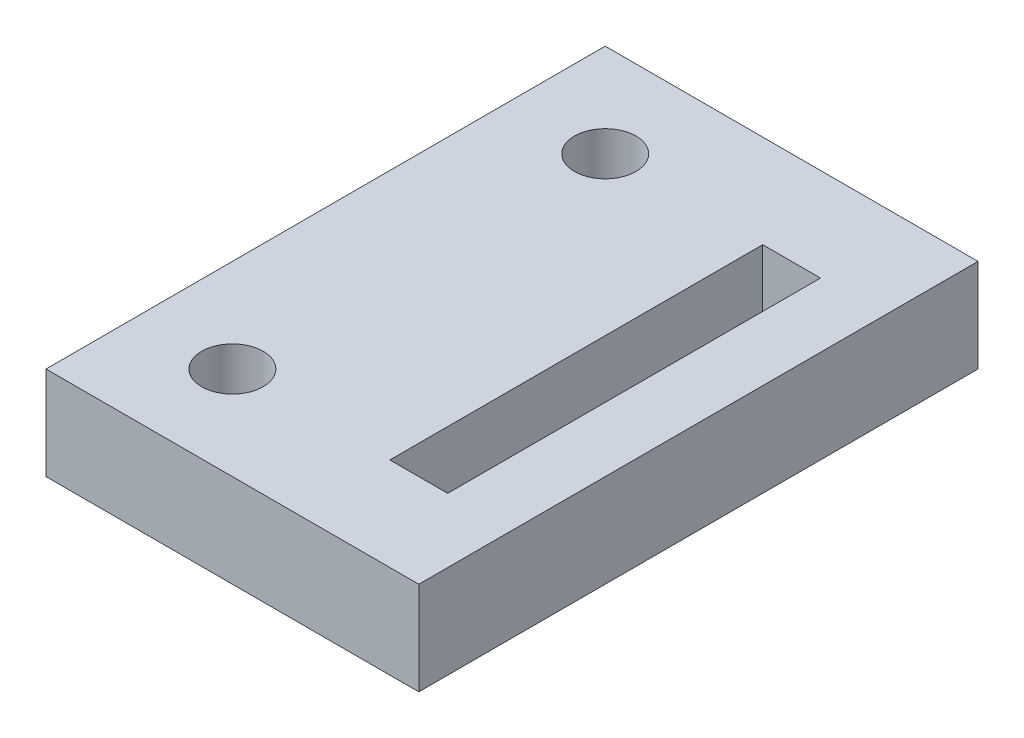
ISO-10303-21;
HEADER;
FILE_DESCRIPTION(('STEP AP214'),'2;1');
FILE_NAME('part.step','',(''),(''),'','','');
FILE_SCHEMA(('AUTOMOTIVE_DESIGN { 1 0 10303 214 1 1 1 1 }'));
ENDSEC;
DATA;
#1=APPLICATION_CONTEXT('core data for automotive mechanical design processes');
#2=APPLICATION_PROTOCOL_DEFINITION('international standard','automotive_design',2000,#1);
#3=PRODUCT_CONTEXT('',#1,'mechanical');
#4=PRODUCT('Part','Part','',(#3));
#5=PRODUCT_RELATED_PRODUCT_CATEGORY('part','',(#4));
#6=PRODUCT_DEFINITION_FORMATION('','',#4);
#7=PRODUCT_DEFINITION_CONTEXT('part definition',#1,'design');
#8=PRODUCT_DEFINITION('design','',#6,#7);
#9=PRODUCT_DEFINITION_SHAPE('','',#8);
#10=(LENGTH_UNIT() NAMED_UNIT(*) SI_UNIT(.MILLI.,.METRE.));
#11=(NAMED_UNIT(*) PLANE_ANGLE_UNIT() SI_UNIT($,.RADIAN.));
#12=(NAMED_UNIT(*) SI_UNIT($,.STERADIAN.) SOLID_ANGLE_UNIT());
#13=UNCERTAINTY_MEASURE_WITH_UNIT(LENGTH_MEASURE(1.E-05),#10,'distance_accuracy_value','');
#14=(GEOMETRIC_REPRESENTATION_CONTEXT(3) GLOBAL_UNCERTAINTY_ASSIGNED_CONTEXT((#13)) GLOBAL_UNIT_ASSIGNED_CONTEXT((#10,
#11,#12)) REPRESENTATION_CONTEXT('',''));
#15=CARTESIAN_POINT('',(0.,0.,0.));
#16=DIRECTION('',(0.,0.,1.));
#17=DIRECTION('',(1.,0.,0.));
#18=AXIS2_PLACEMENT_3D('',#15,#16,#17);
#19=CARTESIAN_POINT('',(0.,5.,0.));
#20=DIRECTION('',(-1.,0.,0.));
#21=DIRECTION('',(0.,0.,1.));
#22=AXIS2_PLACEMENT_3D('',#19,#20,#21);
#23=PLANE('',#22);
#24=DIRECTION('',(0.,0.,-1.));
#25=VECTOR('',#24,1.);
#26=CARTESIAN_POINT('',(0.,0.,0.));
#27=LINE('',#26,#25);
#28=CARTESIAN_POINT('',(0.,0.,0.));
#29=VERTEX_POINT('',#28);
#30=CARTESIAN_POINT('',(0.,0.,-30.));
#31=VERTEX_POINT('',#30);
#32=EDGE_CURVE('E152',#29,#31,#27,.T.);
#33=ORIENTED_EDGE('',*,*,#32,.F.);
#34=DIRECTION('',(0.,-1.,0.));
#35=VECTOR('',#34,1.);
#36=CARTESIAN_POINT('',(0.,5.,0.));
#37=LINE('',#36,#35);
#38=CARTESIAN_POINT('',(0.,5.,0.));
#39=VERTEX_POINT('',#38);
#40=EDGE_CURVE('E11',#39,#29,#37,.T.);
#41=ORIENTED_EDGE('',*,*,#40,.F.);
#42=DIRECTION('',(0.,0.,-1.));
#43=VECTOR('',#42,1.);
#44=CARTESIAN_POINT('',(0.,5.,0.));
#45=LINE('',#44,#43);
#46=CARTESIAN_POINT('',(0.,5.,-30.));
#47=VERTEX_POINT('',#46);
#48=EDGE_CURVE('E118',#39,#47,#45,.T.);
#49=ORIENTED_EDGE('',*,*,#48,.T.);
#50=DIRECTION('',(0.,-1.,0.));
#51=VECTOR('',#50,1.);
#52=CARTESIAN_POINT('',(0.,5.,-30.));
#53=LINE('',#52,#51);
#54=EDGE_CURVE('E57',#47,#31,#53,.T.);
#55=ORIENTED_EDGE('',*,*,#54,.T.);
#56=EDGE_LOOP('',(#33,#41,#49,#55));
#57=FACE_BOUND('',#56,.T.);
#58=ADVANCED_FACE('F38',(#57),#23,.T.);
#59=CARTESIAN_POINT('',(0.,5.,0.));
#60=DIRECTION('',(0.,0.,-1.));
#61=DIRECTION('',(-1.,0.,0.));
#62=AXIS2_PLACEMENT_3D('',#59,#60,#61);
#63=PLANE('',#62);
#64=DIRECTION('',(1.,0.,0.));
#65=VECTOR('',#64,1.);
#66=CARTESIAN_POINT('',(0.,0.,0.));
#67=LINE('',#66,#65);
#68=CARTESIAN_POINT('',(20.,0.,0.));
#69=VERTEX_POINT('',#68);
#70=EDGE_CURVE('E124',#29,#69,#67,.T.);
#71=ORIENTED_EDGE('',*,*,#70,.T.);
#72=DIRECTION('',(0.,-1.,0.));
#73=VECTOR('',#72,1.);
#74=CARTESIAN_POINT('',(20.,5.,0.));
#75=LINE('',#74,#73);
#76=CARTESIAN_POINT('',(20.,5.,0.));
#77=VERTEX_POINT('',#76);
#78=EDGE_CURVE('E48',#77,#69,#75,.T.);
#79=ORIENTED_EDGE('',*,*,#78,.F.);
#80=DIRECTION('',(1.,0.,0.));
#81=VECTOR('',#80,1.);
#82=CARTESIAN_POINT('',(0.,5.,0.));
#83=LINE('',#82,#81);
#84=EDGE_CURVE('E111',#39,#77,#83,.T.);
#85=ORIENTED_EDGE('',*,*,#84,.F.);
#86=ORIENTED_EDGE('',*,*,#40,.T.);
#87=EDGE_LOOP('',(#71,#79,#85,#86));
#88=FACE_BOUND('',#87,.T.);
#89=ADVANCED_FACE('F122',(#88),#63,.F.);
#90=CARTESIAN_POINT('',(20.,5.,0.));
#91=DIRECTION('',(1.,0.,0.));
#92=DIRECTION('',(0.,0.,-1.));
#93=AXIS2_PLACEMENT_3D('',#90,#91,#92);
#94=PLANE('',#93);
#95=DIRECTION('',(0.,0.,1.));
#96=VECTOR('',#95,1.);
#97=CARTESIAN_POINT('',(20.,0.,0.));
#98=LINE('',#97,#96);
#99=CARTESIAN_POINT('',(20.,0.,-30.));
#100=VERTEX_POINT('',#99);
#101=EDGE_CURVE('E155',#100,#69,#98,.T.);
#102=ORIENTED_EDGE('',*,*,#101,.F.);
#103=DIRECTION('',(0.,-1.,0.));
#104=VECTOR('',#103,1.);
#105=CARTESIAN_POINT('',(20.,5.,-30.));
#106=LINE('',#105,#104);
#107=CARTESIAN_POINT('',(20.,5.,-30.));
#108=VERTEX_POINT('',#107);
#109=EDGE_CURVE('E82',#108,#100,#106,.T.);
#110=ORIENTED_EDGE('',*,*,#109,.F.);
#111=DIRECTION('',(0.,0.,1.));
#112=VECTOR('',#111,1.);
#113=CARTESIAN_POINT('',(20.,5.,0.));
#114=LINE('',#113,#112);
#115=EDGE_CURVE('E117',#108,#77,#114,.T.);
#116=ORIENTED_EDGE('',*,*,#115,.T.);
#117=ORIENTED_EDGE('',*,*,#78,.T.);
#118=EDGE_LOOP('',(#102,#110,#116,#117));
#119=FACE_BOUND('',#118,.T.);
#120=ADVANCED_FACE('F128',(#119),#94,.T.);
#121=CARTESIAN_POINT('',(0.,5.,-4.99999999999999));
#122=DIRECTION('',(0.,0.,-1.));
#123=DIRECTION('',(-1.,0.,0.));
#124=AXIS2_PLACEMENT_3D('',#121,#122,#123);
#125=PLANE('',#124);
#126=DIRECTION('',(1.,0.,0.));
#127=VECTOR('',#126,1.);
#128=CARTESIAN_POINT('',(0.,0.,-4.99999999999999));
#129=LINE('',#128,#127);
#130=CARTESIAN_POINT('',(13.45,0.,-5.));
#131=VERTEX_POINT('',#130);
#132=CARTESIAN_POINT('',(16.55,0.,-5.));
#133=VERTEX_POINT('',#132);
#134=EDGE_CURVE('E138',#131,#133,#129,.T.);
#135=ORIENTED_EDGE('',*,*,#134,.F.);
#136=DIRECTION('',(0.,-1.,0.));
#137=VECTOR('',#136,1.);
#138=CARTESIAN_POINT('',(13.45,5.,-5.));
#139=LINE('',#138,#137);
#140=CARTESIAN_POINT('',(13.45,5.,-5.));
#141=VERTEX_POINT('',#140);
#142=EDGE_CURVE('E42',#141,#131,#139,.T.);
#143=ORIENTED_EDGE('',*,*,#142,.F.);
#144=DIRECTION('',(1.,0.,0.));
#145=VECTOR('',#144,1.);
#146=CARTESIAN_POINT('',(0.,5.,-4.99999999999999));
#147=LINE('',#146,#145);
#148=CARTESIAN_POINT('',(16.55,5.,-5.));
#149=VERTEX_POINT('',#148);
#150=EDGE_CURVE('E163',#141,#149,#147,.T.);
#151=ORIENTED_EDGE('',*,*,#150,.T.);
#152=DIRECTION('',(0.,-1.,0.));
#153=VECTOR('',#152,1.);
#154=CARTESIAN_POINT('',(16.55,5.,-5.));
#155=LINE('',#154,#153);
#156=EDGE_CURVE('E137',#149,#133,#155,.T.);
#157=ORIENTED_EDGE('',*,*,#156,.T.);
#158=EDGE_LOOP('',(#135,#143,#151,#157));
#159=FACE_BOUND('',#158,.T.);
#160=ADVANCED_FACE('F40',(#159),#125,.T.);
#161=CARTESIAN_POINT('',(13.45,5.,0.));
#162=DIRECTION('',(1.,0.,0.));
#163=DIRECTION('',(0.,0.,-1.));
#164=AXIS2_PLACEMENT_3D('',#161,#162,#163);
#165=PLANE('',#164);
#166=DIRECTION('',(0.,0.,1.));
#167=VECTOR('',#166,1.);
#168=CARTESIAN_POINT('',(13.45,0.,0.));
#169=LINE('',#168,#167);
#170=CARTESIAN_POINT('',(13.45,0.,-25.));
#171=VERTEX_POINT('',#170);
#172=EDGE_CURVE('E141',#171,#131,#169,.T.);
#173=ORIENTED_EDGE('',*,*,#172,.F.);
#174=DIRECTION('',(0.,-1.,0.));
#175=VECTOR('',#174,1.);
#176=CARTESIAN_POINT('',(13.45,5.,-25.));
#177=LINE('',#176,#175);
#178=CARTESIAN_POINT('',(13.45,5.,-25.));
#179=VERTEX_POINT('',#178);
#180=EDGE_CURVE('E169',#179,#171,#177,.T.);
#181=ORIENTED_EDGE('',*,*,#180,.F.);
#182=DIRECTION('',(0.,0.,1.));
#183=VECTOR('',#182,1.);
#184=CARTESIAN_POINT('',(13.45,5.,0.));
#185=LINE('',#184,#183);
#186=EDGE_CURVE('E178',#179,#141,#185,.T.);
#187=ORIENTED_EDGE('',*,*,#186,.T.);
#188=ORIENTED_EDGE('',*,*,#142,.T.);
#189=EDGE_LOOP('',(#173,#181,#187,#188));
#190=FACE_BOUND('',#189,.T.);
#191=ADVANCED_FACE('F176',(#190),#165,.T.);
#192=CARTESIAN_POINT('',(0.,5.,-25.));
#193=DIRECTION('',(0.,0.,-1.));
#194=DIRECTION('',(-1.,0.,0.));
#195=AXIS2_PLACEMENT_3D('',#192,#193,#194);
#196=PLANE('',#195);
#197=DIRECTION('',(1.,0.,0.));
#198=VECTOR('',#197,1.);
#199=CARTESIAN_POINT('',(0.,0.,-25.));
#200=LINE('',#199,#198);
#201=CARTESIAN_POINT('',(16.55,0.,-25.));
#202=VERTEX_POINT('',#201);
#203=EDGE_CURVE('E144',#171,#202,#200,.T.);
#204=ORIENTED_EDGE('',*,*,#203,.T.);
#205=DIRECTION('',(0.,-1.,0.));
#206=VECTOR('',#205,1.);
#207=CARTESIAN_POINT('',(16.55,5.,-25.));
#208=LINE('',#207,#206);
#209=CARTESIAN_POINT('',(16.55,5.,-25.));
#210=VERTEX_POINT('',#209);
#211=EDGE_CURVE('E167',#210,#202,#208,.T.);
#212=ORIENTED_EDGE('',*,*,#211,.F.);
#213=DIRECTION('',(1.,0.,0.));
#214=VECTOR('',#213,1.);
#215=CARTESIAN_POINT('',(0.,5.,-25.));
#216=LINE('',#215,#214);
#217=EDGE_CURVE('E192',#179,#210,#216,.T.);
#218=ORIENTED_EDGE('',*,*,#217,.F.);
#219=ORIENTED_EDGE('',*,*,#180,.T.);
#220=EDGE_LOOP('',(#204,#212,#218,#219));
#221=FACE_BOUND('',#220,.T.);
#222=ADVANCED_FACE('F185',(#221),#196,.F.);
#223=CARTESIAN_POINT('',(0.,5.,-30.));
#224=DIRECTION('',(0.,0.,-1.));
#225=DIRECTION('',(-1.,0.,0.));
#226=AXIS2_PLACEMENT_3D('',#223,#224,#225);
#227=PLANE('',#226);
#228=DIRECTION('',(1.,0.,0.));
#229=VECTOR('',#228,1.);
#230=CARTESIAN_POINT('',(0.,0.,-30.));
#231=LINE('',#230,#229);
#232=EDGE_CURVE('E157',#31,#100,#231,.T.);
#233=ORIENTED_EDGE('',*,*,#232,.F.);
#234=ORIENTED_EDGE('',*,*,#54,.F.);
#235=DIRECTION('',(1.,0.,0.));
#236=VECTOR('',#235,1.);
#237=CARTESIAN_POINT('',(0.,5.,-30.));
#238=LINE('',#237,#236);
#239=EDGE_CURVE('E129',#47,#108,#238,.T.);
#240=ORIENTED_EDGE('',*,*,#239,.T.);
#241=ORIENTED_EDGE('',*,*,#109,.T.);
#242=EDGE_LOOP('',(#233,#234,#240,#241));
#243=FACE_BOUND('',#242,.T.);
#244=ADVANCED_FACE('F198',(#243),#227,.T.);
#245=CARTESIAN_POINT('',(5.,5.,-25.));
#246=DIRECTION('',(0.,-1.,0.));
#247=DIRECTION('',(0.,0.,-1.));
#248=AXIS2_PLACEMENT_3D('',#245,#246,#247);
#249=CYLINDRICAL_SURFACE('',#248,1.65);
#250=CARTESIAN_POINT('',(5.,5.,-25.));
#251=DIRECTION('',(0.,1.,0.));
#252=DIRECTION('',(0.,0.,1.));
#253=AXIS2_PLACEMENT_3D('',#250,#251,#252);
#254=CIRCLE('',#253,1.65);
#255=CARTESIAN_POINT('',(5.,5.,-23.35));
#256=VERTEX_POINT('',#255);
#257=EDGE_CURVE('E191',#256,#256,#254,.F.);
#258=ORIENTED_EDGE('',*,*,#257,.F.);
#259=EDGE_LOOP('',(#258));
#260=FACE_BOUND('',#259,.T.);
#261=CARTESIAN_POINT('',(5.,0.,-25.));
#262=DIRECTION('',(0.,1.,0.));
#263=DIRECTION('',(0.,0.,1.));
#264=AXIS2_PLACEMENT_3D('',#261,#262,#263);
#265=CIRCLE('',#264,1.65);
#266=CARTESIAN_POINT('',(5.,0.,-23.35));
#267=VERTEX_POINT('',#266);
#268=EDGE_CURVE('E149',#267,#267,#265,.F.);
#269=ORIENTED_EDGE('',*,*,#268,.T.);
#270=EDGE_LOOP('',(#269));
#271=FACE_BOUND('',#270,.T.);
#272=ADVANCED_FACE('F200',(#260,#271),#249,.F.);
#273=CARTESIAN_POINT('',(16.55,5.,0.));
#274=DIRECTION('',(1.,0.,0.));
#275=DIRECTION('',(0.,0.,-1.));
#276=AXIS2_PLACEMENT_3D('',#273,#274,#275);
#277=PLANE('',#276);
#278=DIRECTION('',(0.,0.,1.));
#279=VECTOR('',#278,1.);
#280=CARTESIAN_POINT('',(16.55,0.,0.));
#281=LINE('',#280,#279);
#282=EDGE_CURVE('E146',#202,#133,#281,.T.);
#283=ORIENTED_EDGE('',*,*,#282,.T.);
#284=ORIENTED_EDGE('',*,*,#156,.F.);
#285=DIRECTION('',(0.,0.,1.));
#286=VECTOR('',#285,1.);
#287=CARTESIAN_POINT('',(16.55,5.,0.));
#288=LINE('',#287,#286);
#289=EDGE_CURVE('E189',#210,#149,#288,.T.);
#290=ORIENTED_EDGE('',*,*,#289,.F.);
#291=ORIENTED_EDGE('',*,*,#211,.T.);
#292=EDGE_LOOP('',(#283,#284,#290,#291));
#293=FACE_BOUND('',#292,.T.);
#294=ADVANCED_FACE('F188',(#293),#277,.F.);
#295=CARTESIAN_POINT('',(5.,5.,-5.));
#296=DIRECTION('',(0.,-1.,0.));
#297=DIRECTION('',(0.,0.,-1.));
#298=AXIS2_PLACEMENT_3D('',#295,#296,#297);
#299=CYLINDRICAL_SURFACE('',#298,1.65);
#300=CARTESIAN_POINT('',(5.,5.,-5.));
#301=DIRECTION('',(0.,1.,0.));
#302=DIRECTION('',(0.,0.,1.));
#303=AXIS2_PLACEMENT_3D('',#300,#301,#302);
#304=CIRCLE('',#303,1.65);
#305=CARTESIAN_POINT('',(5.,5.,-3.35));
#306=VERTEX_POINT('',#305);
#307=EDGE_CURVE('E131',#306,#306,#304,.T.);
#308=ORIENTED_EDGE('',*,*,#307,.T.);
#309=EDGE_LOOP('',(#308));
#310=FACE_BOUND('',#309,.T.);
#311=CARTESIAN_POINT('',(5.,0.,-5.));
#312=DIRECTION('',(0.,1.,0.));
#313=DIRECTION('',(0.,0.,1.));
#314=AXIS2_PLACEMENT_3D('',#311,#312,#313);
#315=CIRCLE('',#314,1.65);
#316=CARTESIAN_POINT('',(5.,0.,-3.35));
#317=VERTEX_POINT('',#316);
#318=EDGE_CURVE('E160',#317,#317,#315,.T.);
#319=ORIENTED_EDGE('',*,*,#318,.F.);
#320=EDGE_LOOP('',(#319));
#321=FACE_BOUND('',#320,.T.);
#322=ADVANCED_FACE('F219',(#310,#321),#299,.F.);
#323=CARTESIAN_POINT('',(0.,5.,0.));
#324=DIRECTION('',(0.,1.,0.));
#325=DIRECTION('',(0.,0.,1.));
#326=AXIS2_PLACEMENT_3D('',#323,#324,#325);
#327=PLANE('',#326);
#328=ORIENTED_EDGE('',*,*,#150,.F.);
#329=ORIENTED_EDGE('',*,*,#186,.F.);
#330=ORIENTED_EDGE('',*,*,#217,.T.);
#331=ORIENTED_EDGE('',*,*,#289,.T.);
#332=EDGE_LOOP('',(#328,#329,#330,#331));
#333=FACE_BOUND('',#332,.T.);
#334=ORIENTED_EDGE('',*,*,#257,.T.);
#335=EDGE_LOOP('',(#334));
#336=FACE_BOUND('',#335,.T.);
#337=ORIENTED_EDGE('',*,*,#48,.F.);
#338=ORIENTED_EDGE('',*,*,#84,.T.);
#339=ORIENTED_EDGE('',*,*,#115,.F.);
#340=ORIENTED_EDGE('',*,*,#239,.F.);
#341=EDGE_LOOP('',(#337,#338,#339,#340));
#342=FACE_BOUND('',#341,.T.);
#343=ORIENTED_EDGE('',*,*,#307,.F.);
#344=EDGE_LOOP('',(#343));
#345=FACE_BOUND('',#344,.T.);
#346=ADVANCED_FACE('F113',(#333,#336,#342,#345),#327,.T.);
#347=CARTESIAN_POINT('',(0.,0.,0.));
#348=DIRECTION('',(0.,1.,0.));
#349=DIRECTION('',(0.,0.,1.));
#350=AXIS2_PLACEMENT_3D('',#347,#348,#349);
#351=PLANE('',#350);
#352=ORIENTED_EDGE('',*,*,#134,.T.);
#353=ORIENTED_EDGE('',*,*,#282,.F.);
#354=ORIENTED_EDGE('',*,*,#203,.F.);
#355=ORIENTED_EDGE('',*,*,#172,.T.);
#356=EDGE_LOOP('',(#352,#353,#354,#355));
#357=FACE_BOUND('',#356,.T.);
#358=ORIENTED_EDGE('',*,*,#268,.F.);
#359=EDGE_LOOP('',(#358));
#360=FACE_BOUND('',#359,.T.);
#361=ORIENTED_EDGE('',*,*,#32,.T.);
#362=ORIENTED_EDGE('',*,*,#232,.T.);
#363=ORIENTED_EDGE('',*,*,#101,.T.);
#364=ORIENTED_EDGE('',*,*,#70,.F.);
#365=EDGE_LOOP('',(#361,#362,#363,#364));
#366=FACE_BOUND('',#365,.T.);
#367=ORIENTED_EDGE('',*,*,#318,.T.);
#368=EDGE_LOOP('',(#367));
#369=FACE_BOUND('',#368,.T.);
#370=ADVANCED_FACE('F182',(#357,#360,#366,#369),#351,.F.);
#371=CLOSED_SHELL('',(#58,#89,#120,#160,#191,#222,#244,#272,#294,#322,#346,#370));
#372=MANIFOLD_SOLID_BREP('B2',#371);
#373=ADVANCED_BREP_SHAPE_REPRESENTATION('',(#18,#372),#14);
#374=SHAPE_DEFINITION_REPRESENTATION(#9,#373);
ENDSEC;
END-ISO-10303-21;
